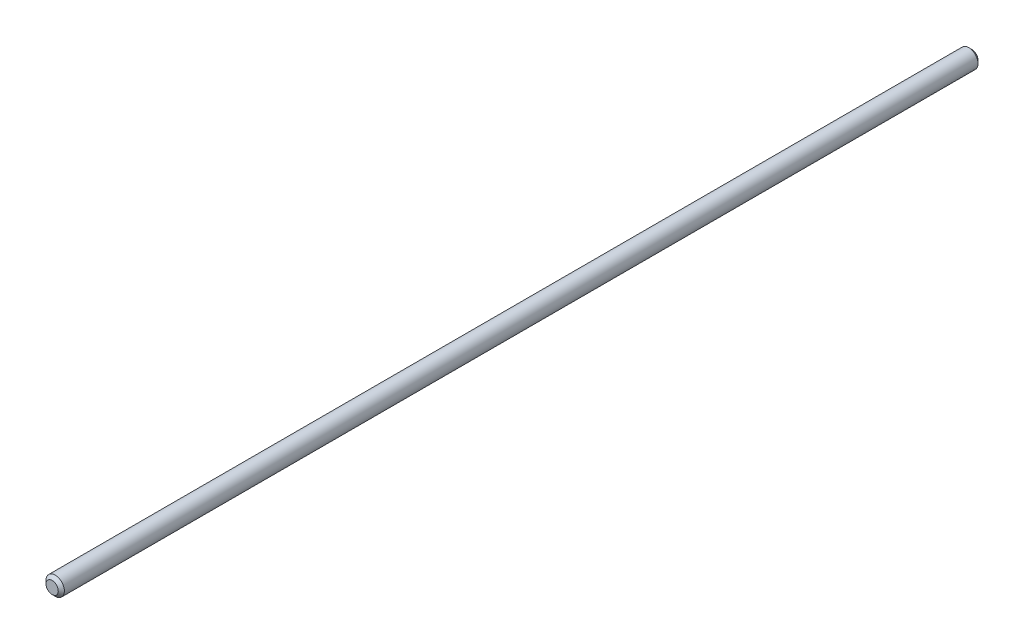
ISO-10303-21;
HEADER;
FILE_DESCRIPTION(('STEP AP214'),'2;1');
FILE_NAME('part.step','',(''),(''),'','','');
FILE_SCHEMA(('AUTOMOTIVE_DESIGN { 1 0 10303 214 1 1 1 1 }'));
ENDSEC;
DATA;
#1=APPLICATION_CONTEXT('core data for automotive mechanical design processes');
#2=APPLICATION_PROTOCOL_DEFINITION('international standard','automotive_design',2000,#1);
#3=PRODUCT_CONTEXT('',#1,'mechanical');
#4=PRODUCT('Part','Part','',(#3));
#5=PRODUCT_RELATED_PRODUCT_CATEGORY('part','',(#4));
#6=PRODUCT_DEFINITION_FORMATION('','',#4);
#7=PRODUCT_DEFINITION_CONTEXT('part definition',#1,'design');
#8=PRODUCT_DEFINITION('design','',#6,#7);
#9=PRODUCT_DEFINITION_SHAPE('','',#8);
#10=(LENGTH_UNIT() NAMED_UNIT(*) SI_UNIT(.MILLI.,.METRE.));
#11=(NAMED_UNIT(*) PLANE_ANGLE_UNIT() SI_UNIT($,.RADIAN.));
#12=(NAMED_UNIT(*) SI_UNIT($,.STERADIAN.) SOLID_ANGLE_UNIT());
#13=UNCERTAINTY_MEASURE_WITH_UNIT(LENGTH_MEASURE(1.E-05),#10,'distance_accuracy_value','');
#14=(GEOMETRIC_REPRESENTATION_CONTEXT(3) GLOBAL_UNCERTAINTY_ASSIGNED_CONTEXT((#13)) GLOBAL_UNIT_ASSIGNED_CONTEXT((#10,
#11,#12)) REPRESENTATION_CONTEXT('',''));
#15=CARTESIAN_POINT('',(0.,0.,0.));
#16=DIRECTION('',(0.,0.,1.));
#17=DIRECTION('',(1.,0.,0.));
#18=AXIS2_PLACEMENT_3D('',#15,#16,#17);
#19=CARTESIAN_POINT('',(0.,0.,600.));
#20=DIRECTION('',(0.,0.,-1.));
#21=DIRECTION('',(-1.,0.,0.));
#22=AXIS2_PLACEMENT_3D('',#19,#20,#21);
#23=CYLINDRICAL_SURFACE('',#22,6.);
#24=CARTESIAN_POINT('',(0.,0.,2.));
#25=DIRECTION('',(0.,0.,1.));
#26=DIRECTION('',(1.,0.,0.));
#27=AXIS2_PLACEMENT_3D('',#24,#25,#26);
#28=CIRCLE('',#27,6.);
#29=CARTESIAN_POINT('',(6.,0.,2.));
#30=VERTEX_POINT('',#29);
#31=EDGE_CURVE('E42',#30,#30,#28,.T.);
#32=ORIENTED_EDGE('',*,*,#31,.T.);
#33=EDGE_LOOP('',(#32));
#34=FACE_BOUND('',#33,.T.);
#35=CARTESIAN_POINT('',(0.,0.,598.));
#36=DIRECTION('',(0.,0.,1.));
#37=DIRECTION('',(1.,0.,0.));
#38=AXIS2_PLACEMENT_3D('',#35,#36,#37);
#39=CIRCLE('',#38,6.);
#40=CARTESIAN_POINT('',(6.,0.,598.));
#41=VERTEX_POINT('',#40);
#42=EDGE_CURVE('E46',#41,#41,#39,.F.);
#43=ORIENTED_EDGE('',*,*,#42,.T.);
#44=EDGE_LOOP('',(#43));
#45=FACE_BOUND('',#44,.T.);
#46=ADVANCED_FACE('F31',(#34,#45),#23,.T.);
#47=CARTESIAN_POINT('',(0.,0.,600.));
#48=DIRECTION('',(0.,0.,1.));
#49=DIRECTION('',(1.,0.,0.));
#50=AXIS2_PLACEMENT_3D('',#47,#48,#49);
#51=PLANE('',#50);
#52=CARTESIAN_POINT('',(0.,0.,600.));
#53=DIRECTION('',(0.,0.,1.));
#54=DIRECTION('',(1.,0.,0.));
#55=AXIS2_PLACEMENT_3D('',#52,#53,#54);
#56=CIRCLE('',#55,4.00000000000011);
#57=CARTESIAN_POINT('',(4.00000000000011,0.,600.));
#58=VERTEX_POINT('',#57);
#59=EDGE_CURVE('E10',#58,#58,#56,.T.);
#60=ORIENTED_EDGE('',*,*,#59,.T.);
#61=EDGE_LOOP('',(#60));
#62=FACE_BOUND('',#61,.T.);
#63=ADVANCED_FACE('F62',(#62),#51,.T.);
#64=CARTESIAN_POINT('',(0.,0.,0.));
#65=DIRECTION('',(0.,0.,1.));
#66=DIRECTION('',(1.,0.,0.));
#67=AXIS2_PLACEMENT_3D('',#64,#65,#66);
#68=PLANE('',#67);
#69=CARTESIAN_POINT('',(0.,0.,0.));
#70=DIRECTION('',(0.,0.,1.));
#71=DIRECTION('',(1.,0.,0.));
#72=AXIS2_PLACEMENT_3D('',#69,#70,#71);
#73=CIRCLE('',#72,4.);
#74=CARTESIAN_POINT('',(4.,0.,0.));
#75=VERTEX_POINT('',#74);
#76=EDGE_CURVE('E38',#75,#75,#73,.F.);
#77=ORIENTED_EDGE('',*,*,#76,.T.);
#78=EDGE_LOOP('',(#77));
#79=FACE_BOUND('',#78,.T.);
#80=ADVANCED_FACE('F59',(#79),#68,.F.);
#81=CARTESIAN_POINT('',(0.,0.,2.));
#82=DIRECTION('',(0.,0.,1.));
#83=DIRECTION('',(1.,0.,0.));
#84=AXIS2_PLACEMENT_3D('',#81,#82,#83);
#85=CONICAL_SURFACE('',#84,6.,0.785398163397447);
#86=ORIENTED_EDGE('',*,*,#76,.F.);
#87=EDGE_LOOP('',(#86));
#88=FACE_BOUND('',#87,.T.);
#89=ORIENTED_EDGE('',*,*,#31,.F.);
#90=EDGE_LOOP('',(#89));
#91=FACE_BOUND('',#90,.T.);
#92=ADVANCED_FACE('F55',(#88,#91),#85,.T.);
#93=CARTESIAN_POINT('',(0.,0.,600.));
#94=DIRECTION('',(0.,0.,-1.));
#95=DIRECTION('',(-1.,0.,0.));
#96=AXIS2_PLACEMENT_3D('',#93,#94,#95);
#97=CONICAL_SURFACE('',#96,4.00000000000011,0.785398163397475);
#98=ORIENTED_EDGE('',*,*,#42,.F.);
#99=EDGE_LOOP('',(#98));
#100=FACE_BOUND('',#99,.T.);
#101=ORIENTED_EDGE('',*,*,#59,.F.);
#102=EDGE_LOOP('',(#101));
#103=FACE_BOUND('',#102,.T.);
#104=ADVANCED_FACE('F33',(#100,#103),#97,.T.);
#105=CLOSED_SHELL('',(#46,#63,#80,#92,#104));
#106=MANIFOLD_SOLID_BREP('B2',#105);
#107=ADVANCED_BREP_SHAPE_REPRESENTATION('',(#18,#106),#14);
#108=SHAPE_DEFINITION_REPRESENTATION(#9,#107);
ENDSEC;
END-ISO-10303-21;
